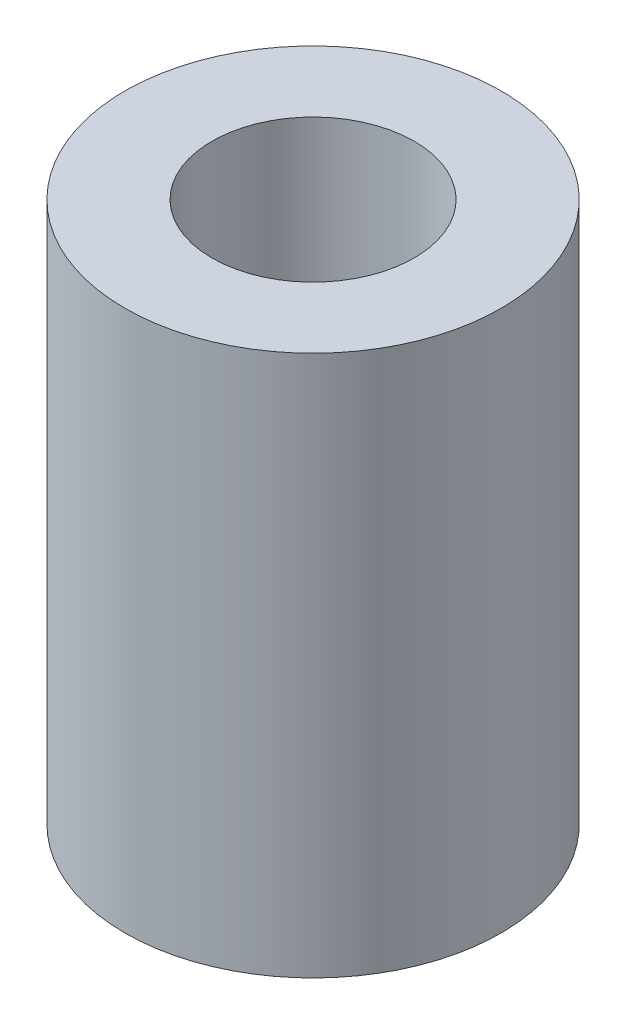
ISO-10303-21;
HEADER;
FILE_DESCRIPTION(('STEP AP214'),'2;1');
FILE_NAME('part.step','',(''),(''),'','','');
FILE_SCHEMA(('AUTOMOTIVE_DESIGN { 1 0 10303 214 1 1 1 1 }'));
ENDSEC;
DATA;
#1=APPLICATION_CONTEXT('core data for automotive mechanical design processes');
#2=APPLICATION_PROTOCOL_DEFINITION('international standard','automotive_design',2000,#1);
#3=PRODUCT_CONTEXT('',#1,'mechanical');
#4=PRODUCT('Part','Part','',(#3));
#5=PRODUCT_RELATED_PRODUCT_CATEGORY('part','',(#4));
#6=PRODUCT_DEFINITION_FORMATION('','',#4);
#7=PRODUCT_DEFINITION_CONTEXT('part definition',#1,'design');
#8=PRODUCT_DEFINITION('design','',#6,#7);
#9=PRODUCT_DEFINITION_SHAPE('','',#8);
#10=(LENGTH_UNIT() NAMED_UNIT(*) SI_UNIT(.MILLI.,.METRE.));
#11=(NAMED_UNIT(*) PLANE_ANGLE_UNIT() SI_UNIT($,.RADIAN.));
#12=(NAMED_UNIT(*) SI_UNIT($,.STERADIAN.) SOLID_ANGLE_UNIT());
#13=UNCERTAINTY_MEASURE_WITH_UNIT(LENGTH_MEASURE(1.E-05),#10,'distance_accuracy_value','');
#14=(GEOMETRIC_REPRESENTATION_CONTEXT(3) GLOBAL_UNCERTAINTY_ASSIGNED_CONTEXT((#13)) GLOBAL_UNIT_ASSIGNED_CONTEXT((#10,
#11,#12)) REPRESENTATION_CONTEXT('',''));
#15=CARTESIAN_POINT('',(0.,0.,0.));
#16=DIRECTION('',(0.,0.,1.));
#17=DIRECTION('',(1.,0.,0.));
#18=AXIS2_PLACEMENT_3D('',#15,#16,#17);
#19=CARTESIAN_POINT('',(0.,11.5,0.));
#20=DIRECTION('',(0.,1.,0.));
#21=DIRECTION('',(0.,0.,1.));
#22=AXIS2_PLACEMENT_3D('',#19,#20,#21);
#23=PLANE('',#22);
#24=CARTESIAN_POINT('',(0.,11.5,0.));
#25=DIRECTION('',(0.,1.,0.));
#26=DIRECTION('',(0.,0.,1.));
#27=AXIS2_PLACEMENT_3D('',#24,#25,#26);
#28=CIRCLE('',#27,4.);
#29=CARTESIAN_POINT('',(0.,11.5,4.));
#30=VERTEX_POINT('',#29);
#31=EDGE_CURVE('E10',#30,#30,#28,.T.);
#32=ORIENTED_EDGE('',*,*,#31,.T.);
#33=EDGE_LOOP('',(#32));
#34=FACE_BOUND('',#33,.T.);
#35=CARTESIAN_POINT('',(0.,11.5,0.));
#36=DIRECTION('',(0.,1.,0.));
#37=DIRECTION('',(0.,0.,1.));
#38=AXIS2_PLACEMENT_3D('',#35,#36,#37);
#39=CIRCLE('',#38,2.15);
#40=CARTESIAN_POINT('',(0.,11.5,2.15));
#41=VERTEX_POINT('',#40);
#42=EDGE_CURVE('E43',#41,#41,#39,.T.);
#43=ORIENTED_EDGE('',*,*,#42,.F.);
#44=EDGE_LOOP('',(#43));
#45=FACE_BOUND('',#44,.T.);
#46=ADVANCED_FACE('F32',(#34,#45),#23,.T.);
#47=CARTESIAN_POINT('',(0.,0.,0.));
#48=DIRECTION('',(0.,1.,0.));
#49=DIRECTION('',(0.,0.,1.));
#50=AXIS2_PLACEMENT_3D('',#47,#48,#49);
#51=PLANE('',#50);
#52=CARTESIAN_POINT('',(0.,0.,0.));
#53=DIRECTION('',(0.,1.,0.));
#54=DIRECTION('',(0.,0.,1.));
#55=AXIS2_PLACEMENT_3D('',#52,#53,#54);
#56=CIRCLE('',#55,4.);
#57=CARTESIAN_POINT('',(0.,0.,4.));
#58=VERTEX_POINT('',#57);
#59=EDGE_CURVE('E36',#58,#58,#56,.T.);
#60=ORIENTED_EDGE('',*,*,#59,.F.);
#61=EDGE_LOOP('',(#60));
#62=FACE_BOUND('',#61,.T.);
#63=CARTESIAN_POINT('',(0.,0.,0.));
#64=DIRECTION('',(0.,1.,0.));
#65=DIRECTION('',(0.,0.,1.));
#66=AXIS2_PLACEMENT_3D('',#63,#64,#65);
#67=CIRCLE('',#66,2.15);
#68=CARTESIAN_POINT('',(0.,0.,2.15));
#69=VERTEX_POINT('',#68);
#70=EDGE_CURVE('E45',#69,#69,#67,.T.);
#71=ORIENTED_EDGE('',*,*,#70,.T.);
#72=EDGE_LOOP('',(#71));
#73=FACE_BOUND('',#72,.T.);
#74=ADVANCED_FACE('F55',(#62,#73),#51,.F.);
#75=CARTESIAN_POINT('',(0.,11.5,0.));
#76=DIRECTION('',(0.,-1.,0.));
#77=DIRECTION('',(0.,0.,-1.));
#78=AXIS2_PLACEMENT_3D('',#75,#76,#77);
#79=CYLINDRICAL_SURFACE('',#78,4.);
#80=ORIENTED_EDGE('',*,*,#31,.F.);
#81=EDGE_LOOP('',(#80));
#82=FACE_BOUND('',#81,.T.);
#83=ORIENTED_EDGE('',*,*,#59,.T.);
#84=EDGE_LOOP('',(#83));
#85=FACE_BOUND('',#84,.T.);
#86=ADVANCED_FACE('F34',(#82,#85),#79,.T.);
#87=CARTESIAN_POINT('',(0.,11.5,0.));
#88=DIRECTION('',(0.,-1.,0.));
#89=DIRECTION('',(0.,0.,-1.));
#90=AXIS2_PLACEMENT_3D('',#87,#88,#89);
#91=CYLINDRICAL_SURFACE('',#90,2.15);
#92=ORIENTED_EDGE('',*,*,#42,.T.);
#93=EDGE_LOOP('',(#92));
#94=FACE_BOUND('',#93,.T.);
#95=ORIENTED_EDGE('',*,*,#70,.F.);
#96=EDGE_LOOP('',(#95));
#97=FACE_BOUND('',#96,.T.);
#98=ADVANCED_FACE('F51',(#94,#97),#91,.F.);
#99=CLOSED_SHELL('',(#46,#74,#86,#98));
#100=MANIFOLD_SOLID_BREP('B2',#99);
#101=ADVANCED_BREP_SHAPE_REPRESENTATION('',(#18,#100),#14);
#102=SHAPE_DEFINITION_REPRESENTATION(#9,#101);
ENDSEC;
END-ISO-10303-21;
